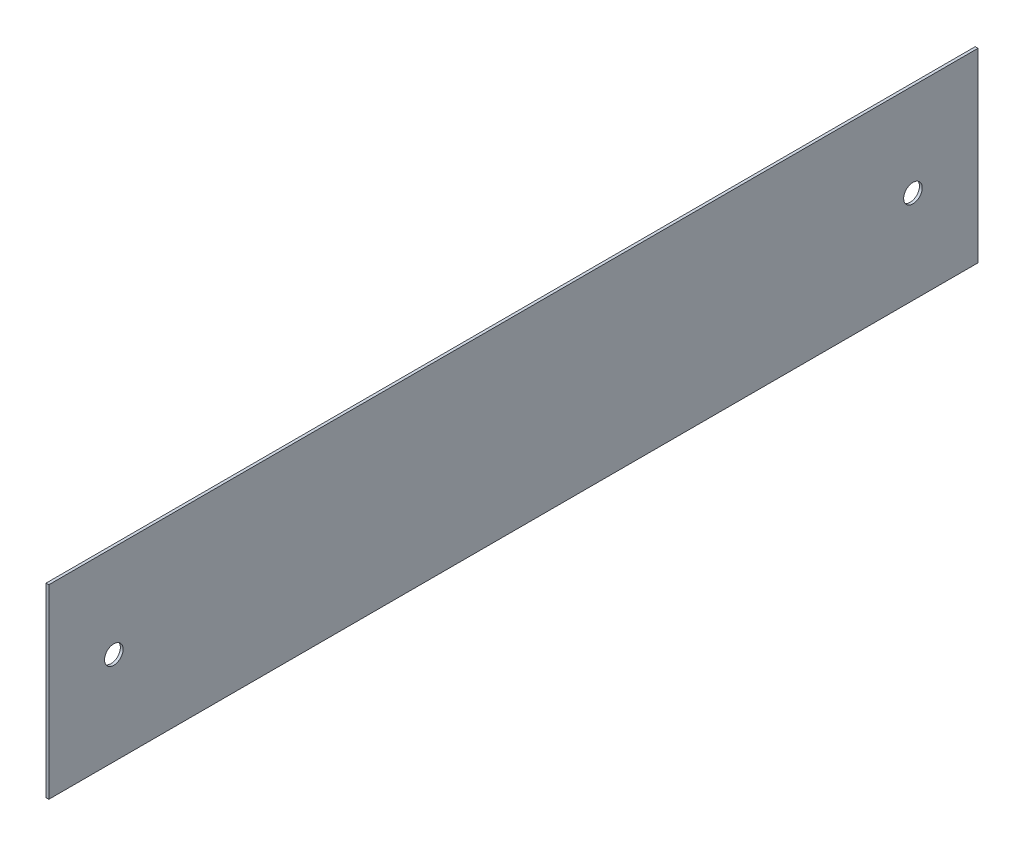
ISO-10303-21;
HEADER;
FILE_DESCRIPTION(('STEP AP214'),'2;1');
FILE_NAME('part.step','',(''),(''),'','','');
FILE_SCHEMA(('AUTOMOTIVE_DESIGN { 1 0 10303 214 1 1 1 1 }'));
ENDSEC;
DATA;
#1=APPLICATION_CONTEXT('core data for automotive mechanical design processes');
#2=APPLICATION_PROTOCOL_DEFINITION('international standard','automotive_design',2000,#1);
#3=PRODUCT_CONTEXT('',#1,'mechanical');
#4=PRODUCT('Part','Part','',(#3));
#5=PRODUCT_RELATED_PRODUCT_CATEGORY('part','',(#4));
#6=PRODUCT_DEFINITION_FORMATION('','',#4);
#7=PRODUCT_DEFINITION_CONTEXT('part definition',#1,'design');
#8=PRODUCT_DEFINITION('design','',#6,#7);
#9=PRODUCT_DEFINITION_SHAPE('','',#8);
#10=(LENGTH_UNIT() NAMED_UNIT(*) SI_UNIT(.MILLI.,.METRE.));
#11=(NAMED_UNIT(*) PLANE_ANGLE_UNIT() SI_UNIT($,.RADIAN.));
#12=(NAMED_UNIT(*) SI_UNIT($,.STERADIAN.) SOLID_ANGLE_UNIT());
#13=UNCERTAINTY_MEASURE_WITH_UNIT(LENGTH_MEASURE(1.E-05),#10,'distance_accuracy_value','');
#14=(GEOMETRIC_REPRESENTATION_CONTEXT(3) GLOBAL_UNCERTAINTY_ASSIGNED_CONTEXT((#13)) GLOBAL_UNIT_ASSIGNED_CONTEXT((#10,
#11,#12)) REPRESENTATION_CONTEXT('',''));
#15=CARTESIAN_POINT('',(0.,0.,0.));
#16=DIRECTION('',(0.,0.,1.));
#17=DIRECTION('',(1.,0.,0.));
#18=AXIS2_PLACEMENT_3D('',#15,#16,#17);
#19=CARTESIAN_POINT('',(3.,-200.,500.));
#20=DIRECTION('',(0.,1.,0.));
#21=DIRECTION('',(0.,0.,1.));
#22=AXIS2_PLACEMENT_3D('',#19,#20,#21);
#23=PLANE('',#22);
#24=DIRECTION('',(0.,0.,-1.));
#25=VECTOR('',#24,1.);
#26=CARTESIAN_POINT('',(0.,-200.,500.));
#27=LINE('',#26,#25);
#28=CARTESIAN_POINT('',(0.,-200.,500.));
#29=VERTEX_POINT('',#28);
#30=CARTESIAN_POINT('',(0.,-200.,-500.));
#31=VERTEX_POINT('',#30);
#32=EDGE_CURVE('E110',#29,#31,#27,.T.);
#33=ORIENTED_EDGE('',*,*,#32,.T.);
#34=DIRECTION('',(-1.,0.,0.));
#35=VECTOR('',#34,1.);
#36=CARTESIAN_POINT('',(3.,-200.,-500.));
#37=LINE('',#36,#35);
#38=CARTESIAN_POINT('',(3.,-200.,-500.));
#39=VERTEX_POINT('',#38);
#40=EDGE_CURVE('E11',#39,#31,#37,.T.);
#41=ORIENTED_EDGE('',*,*,#40,.F.);
#42=DIRECTION('',(0.,0.,-1.));
#43=VECTOR('',#42,1.);
#44=CARTESIAN_POINT('',(3.,-200.,500.));
#45=LINE('',#44,#43);
#46=CARTESIAN_POINT('',(3.,-200.,500.));
#47=VERTEX_POINT('',#46);
#48=EDGE_CURVE('E82',#47,#39,#45,.T.);
#49=ORIENTED_EDGE('',*,*,#48,.F.);
#50=DIRECTION('',(-1.,0.,0.));
#51=VECTOR('',#50,1.);
#52=CARTESIAN_POINT('',(3.,-200.,500.));
#53=LINE('',#52,#51);
#54=EDGE_CURVE('E58',#47,#29,#53,.T.);
#55=ORIENTED_EDGE('',*,*,#54,.T.);
#56=EDGE_LOOP('',(#33,#41,#49,#55));
#57=FACE_BOUND('',#56,.T.);
#58=ADVANCED_FACE('F39',(#57),#23,.F.);
#59=CARTESIAN_POINT('',(3.,0.,-500.));
#60=DIRECTION('',(0.,0.,-1.));
#61=DIRECTION('',(-1.,0.,0.));
#62=AXIS2_PLACEMENT_3D('',#59,#60,#61);
#63=PLANE('',#62);
#64=DIRECTION('',(0.,-1.,0.));
#65=VECTOR('',#64,1.);
#66=CARTESIAN_POINT('',(0.,0.,-500.));
#67=LINE('',#66,#65);
#68=CARTESIAN_POINT('',(0.,0.,-500.));
#69=VERTEX_POINT('',#68);
#70=EDGE_CURVE('E91',#69,#31,#67,.T.);
#71=ORIENTED_EDGE('',*,*,#70,.F.);
#72=DIRECTION('',(-1.,0.,0.));
#73=VECTOR('',#72,1.);
#74=CARTESIAN_POINT('',(3.,0.,-500.));
#75=LINE('',#74,#73);
#76=CARTESIAN_POINT('',(3.,0.,-500.));
#77=VERTEX_POINT('',#76);
#78=EDGE_CURVE('E49',#77,#69,#75,.T.);
#79=ORIENTED_EDGE('',*,*,#78,.F.);
#80=DIRECTION('',(0.,-1.,0.));
#81=VECTOR('',#80,1.);
#82=CARTESIAN_POINT('',(3.,0.,-500.));
#83=LINE('',#82,#81);
#84=EDGE_CURVE('E89',#77,#39,#83,.T.);
#85=ORIENTED_EDGE('',*,*,#84,.T.);
#86=ORIENTED_EDGE('',*,*,#40,.T.);
#87=EDGE_LOOP('',(#71,#79,#85,#86));
#88=FACE_BOUND('',#87,.T.);
#89=ADVANCED_FACE('F88',(#88),#63,.T.);
#90=CARTESIAN_POINT('',(3.,0.,500.));
#91=DIRECTION('',(0.,1.,0.));
#92=DIRECTION('',(0.,0.,1.));
#93=AXIS2_PLACEMENT_3D('',#90,#91,#92);
#94=PLANE('',#93);
#95=DIRECTION('',(0.,0.,-1.));
#96=VECTOR('',#95,1.);
#97=CARTESIAN_POINT('',(0.,0.,500.));
#98=LINE('',#97,#96);
#99=CARTESIAN_POINT('',(0.,0.,500.));
#100=VERTEX_POINT('',#99);
#101=EDGE_CURVE('E115',#100,#69,#98,.T.);
#102=ORIENTED_EDGE('',*,*,#101,.F.);
#103=DIRECTION('',(-1.,0.,0.));
#104=VECTOR('',#103,1.);
#105=CARTESIAN_POINT('',(3.,0.,500.));
#106=LINE('',#105,#104);
#107=CARTESIAN_POINT('',(3.,0.,500.));
#108=VERTEX_POINT('',#107);
#109=EDGE_CURVE('E71',#108,#100,#106,.T.);
#110=ORIENTED_EDGE('',*,*,#109,.F.);
#111=DIRECTION('',(0.,0.,-1.));
#112=VECTOR('',#111,1.);
#113=CARTESIAN_POINT('',(3.,0.,500.));
#114=LINE('',#113,#112);
#115=EDGE_CURVE('E99',#108,#77,#114,.T.);
#116=ORIENTED_EDGE('',*,*,#115,.T.);
#117=ORIENTED_EDGE('',*,*,#78,.T.);
#118=EDGE_LOOP('',(#102,#110,#116,#117));
#119=FACE_BOUND('',#118,.T.);
#120=ADVANCED_FACE('F102',(#119),#94,.T.);
#121=CARTESIAN_POINT('',(3.,-200.,500.));
#122=DIRECTION('',(0.,0.,1.));
#123=DIRECTION('',(1.,0.,0.));
#124=AXIS2_PLACEMENT_3D('',#121,#122,#123);
#125=PLANE('',#124);
#126=DIRECTION('',(0.,1.,0.));
#127=VECTOR('',#126,1.);
#128=CARTESIAN_POINT('',(0.,-200.,500.));
#129=LINE('',#128,#127);
#130=EDGE_CURVE('E118',#29,#100,#129,.T.);
#131=ORIENTED_EDGE('',*,*,#130,.F.);
#132=ORIENTED_EDGE('',*,*,#54,.F.);
#133=DIRECTION('',(0.,1.,0.));
#134=VECTOR('',#133,1.);
#135=CARTESIAN_POINT('',(3.,-200.,500.));
#136=LINE('',#135,#134);
#137=EDGE_CURVE('E104',#47,#108,#136,.T.);
#138=ORIENTED_EDGE('',*,*,#137,.T.);
#139=ORIENTED_EDGE('',*,*,#109,.T.);
#140=EDGE_LOOP('',(#131,#132,#138,#139));
#141=FACE_BOUND('',#140,.T.);
#142=ADVANCED_FACE('F149',(#141),#125,.T.);
#143=CARTESIAN_POINT('',(3.,0.,0.));
#144=DIRECTION('',(-1.,0.,0.));
#145=DIRECTION('',(0.,0.,1.));
#146=AXIS2_PLACEMENT_3D('',#143,#144,#145);
#147=PLANE('',#146);
#148=CARTESIAN_POINT('',(3.,-100.,430.));
#149=DIRECTION('',(1.,0.,0.));
#150=DIRECTION('',(0.,0.,-1.));
#151=AXIS2_PLACEMENT_3D('',#148,#149,#150);
#152=CIRCLE('',#151,10.);
#153=CARTESIAN_POINT('',(3.,-100.,420.));
#154=VERTEX_POINT('',#153);
#155=EDGE_CURVE('E128',#154,#154,#152,.T.);
#156=ORIENTED_EDGE('',*,*,#155,.F.);
#157=EDGE_LOOP('',(#156));
#158=FACE_BOUND('',#157,.T.);
#159=CARTESIAN_POINT('',(3.,-100.,-430.));
#160=DIRECTION('',(1.,0.,0.));
#161=DIRECTION('',(0.,0.,-1.));
#162=AXIS2_PLACEMENT_3D('',#159,#160,#161);
#163=CIRCLE('',#162,10.);
#164=CARTESIAN_POINT('',(3.,-100.,-440.));
#165=VERTEX_POINT('',#164);
#166=EDGE_CURVE('E135',#165,#165,#163,.T.);
#167=ORIENTED_EDGE('',*,*,#166,.F.);
#168=EDGE_LOOP('',(#167));
#169=FACE_BOUND('',#168,.T.);
#170=ORIENTED_EDGE('',*,*,#48,.T.);
#171=ORIENTED_EDGE('',*,*,#84,.F.);
#172=ORIENTED_EDGE('',*,*,#115,.F.);
#173=ORIENTED_EDGE('',*,*,#137,.F.);
#174=EDGE_LOOP('',(#170,#171,#172,#173));
#175=FACE_BOUND('',#174,.T.);
#176=ADVANCED_FACE('F98',(#158,#169,#175),#147,.F.);
#177=CARTESIAN_POINT('',(0.,0.,0.));
#178=DIRECTION('',(-1.,0.,0.));
#179=DIRECTION('',(0.,0.,1.));
#180=AXIS2_PLACEMENT_3D('',#177,#178,#179);
#181=PLANE('',#180);
#182=CARTESIAN_POINT('',(0.,-100.,430.));
#183=DIRECTION('',(-1.,0.,0.));
#184=DIRECTION('',(0.,0.,1.));
#185=AXIS2_PLACEMENT_3D('',#182,#183,#184);
#186=CIRCLE('',#185,10.);
#187=CARTESIAN_POINT('',(0.,-100.,440.));
#188=VERTEX_POINT('',#187);
#189=EDGE_CURVE('E42',#188,#188,#186,.T.);
#190=ORIENTED_EDGE('',*,*,#189,.F.);
#191=EDGE_LOOP('',(#190));
#192=FACE_BOUND('',#191,.T.);
#193=CARTESIAN_POINT('',(0.,-100.,-430.));
#194=DIRECTION('',(-1.,0.,0.));
#195=DIRECTION('',(0.,0.,1.));
#196=AXIS2_PLACEMENT_3D('',#193,#194,#195);
#197=CIRCLE('',#196,10.);
#198=CARTESIAN_POINT('',(0.,-100.,-420.));
#199=VERTEX_POINT('',#198);
#200=EDGE_CURVE('E125',#199,#199,#197,.T.);
#201=ORIENTED_EDGE('',*,*,#200,.F.);
#202=EDGE_LOOP('',(#201));
#203=FACE_BOUND('',#202,.T.);
#204=ORIENTED_EDGE('',*,*,#32,.F.);
#205=ORIENTED_EDGE('',*,*,#130,.T.);
#206=ORIENTED_EDGE('',*,*,#101,.T.);
#207=ORIENTED_EDGE('',*,*,#70,.T.);
#208=EDGE_LOOP('',(#204,#205,#206,#207));
#209=FACE_BOUND('',#208,.T.);
#210=ADVANCED_FACE('F148',(#192,#203,#209),#181,.T.);
#211=CARTESIAN_POINT('',(-2.,-100.,-430.));
#212=DIRECTION('',(1.,0.,0.));
#213=DIRECTION('',(0.,0.,-1.));
#214=AXIS2_PLACEMENT_3D('',#211,#212,#213);
#215=CYLINDRICAL_SURFACE('',#214,10.);
#216=ORIENTED_EDGE('',*,*,#200,.T.);
#217=EDGE_LOOP('',(#216));
#218=FACE_BOUND('',#217,.T.);
#219=ORIENTED_EDGE('',*,*,#166,.T.);
#220=EDGE_LOOP('',(#219));
#221=FACE_BOUND('',#220,.T.);
#222=ADVANCED_FACE('F145',(#218,#221),#215,.F.);
#223=CARTESIAN_POINT('',(-2.,-100.,430.));
#224=DIRECTION('',(1.,0.,0.));
#225=DIRECTION('',(0.,0.,-1.));
#226=AXIS2_PLACEMENT_3D('',#223,#224,#225);
#227=CYLINDRICAL_SURFACE('',#226,10.);
#228=ORIENTED_EDGE('',*,*,#189,.T.);
#229=EDGE_LOOP('',(#228));
#230=FACE_BOUND('',#229,.T.);
#231=ORIENTED_EDGE('',*,*,#155,.T.);
#232=EDGE_LOOP('',(#231));
#233=FACE_BOUND('',#232,.T.);
#234=ADVANCED_FACE('F194',(#230,#233),#227,.F.);
#235=CLOSED_SHELL('',(#58,#89,#120,#142,#176,#210,#222,#234));
#236=MANIFOLD_SOLID_BREP('B2',#235);
#237=ADVANCED_BREP_SHAPE_REPRESENTATION('',(#18,#236),#14);
#238=SHAPE_DEFINITION_REPRESENTATION(#9,#237);
ENDSEC;
END-ISO-10303-21;
